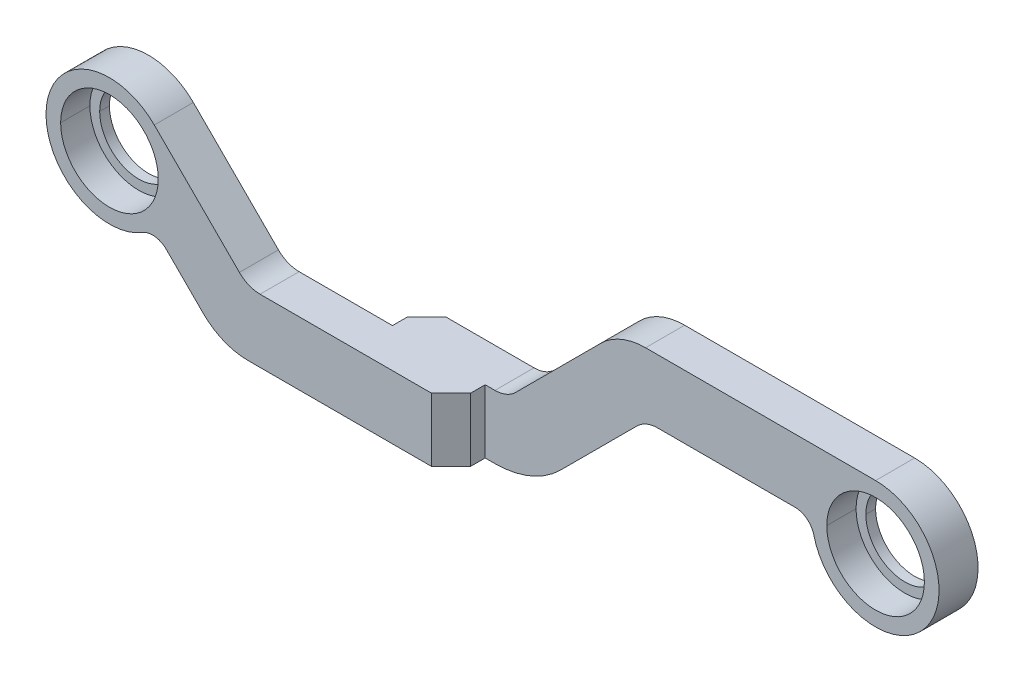
ISO-10303-21;
HEADER;
FILE_DESCRIPTION(('STEP AP214'),'2;1');
FILE_NAME('part.step','',(''),(''),'','','');
FILE_SCHEMA(('AUTOMOTIVE_DESIGN { 1 0 10303 214 1 1 1 1 }'));
ENDSEC;
DATA;
#1=APPLICATION_CONTEXT('core data for automotive mechanical design processes');
#2=APPLICATION_PROTOCOL_DEFINITION('international standard','automotive_design',2000,#1);
#3=PRODUCT_CONTEXT('',#1,'mechanical');
#4=PRODUCT('Part','Part','',(#3));
#5=PRODUCT_RELATED_PRODUCT_CATEGORY('part','',(#4));
#6=PRODUCT_DEFINITION_FORMATION('','',#4);
#7=PRODUCT_DEFINITION_CONTEXT('part definition',#1,'design');
#8=PRODUCT_DEFINITION('design','',#6,#7);
#9=PRODUCT_DEFINITION_SHAPE('','',#8);
#10=(LENGTH_UNIT() NAMED_UNIT(*) SI_UNIT(.MILLI.,.METRE.));
#11=(NAMED_UNIT(*) PLANE_ANGLE_UNIT() SI_UNIT($,.RADIAN.));
#12=(NAMED_UNIT(*) SI_UNIT($,.STERADIAN.) SOLID_ANGLE_UNIT());
#13=UNCERTAINTY_MEASURE_WITH_UNIT(LENGTH_MEASURE(1.E-05),#10,'distance_accuracy_value','');
#14=(GEOMETRIC_REPRESENTATION_CONTEXT(3) GLOBAL_UNCERTAINTY_ASSIGNED_CONTEXT((#13)) GLOBAL_UNIT_ASSIGNED_CONTEXT((#10,
#11,#12)) REPRESENTATION_CONTEXT('',''));
#15=CARTESIAN_POINT('',(0.,0.,0.));
#16=DIRECTION('',(0.,0.,1.));
#17=DIRECTION('',(1.,0.,0.));
#18=AXIS2_PLACEMENT_3D('',#15,#16,#17);
#19=CARTESIAN_POINT('',(66.7386441790709,-2.,4.));
#20=DIRECTION('',(0.,0.,-1.));
#21=DIRECTION('',(-1.,0.,0.));
#22=AXIS2_PLACEMENT_3D('',#19,#20,#21);
#23=CYLINDRICAL_SURFACE('',#22,2.);
#24=CARTESIAN_POINT('',(66.7386441790709,-2.,-3.5));
#25=DIRECTION('',(0.,0.,1.));
#26=DIRECTION('',(-1.,0.,0.));
#27=AXIS2_PLACEMENT_3D('',#24,#25,#26);
#28=CIRCLE('',#27,2.);
#29=CARTESIAN_POINT('',(68.6824926075248,-1.52941176470587,-3.5));
#30=VERTEX_POINT('',#29);
#31=CARTESIAN_POINT('',(66.7386441790709,0.,-3.5));
#32=VERTEX_POINT('',#31);
#33=EDGE_CURVE('E609',#30,#32,#28,.T.);
#34=ORIENTED_EDGE('',*,*,#33,.F.);
#35=DIRECTION('',(0.,0.,-1.));
#36=VECTOR('',#35,1.);
#37=CARTESIAN_POINT('',(68.6824926075248,-1.52941176470587,4.));
#38=LINE('',#37,#36);
#39=CARTESIAN_POINT('',(68.6824926075248,-1.52941176470587,0.5));
#40=VERTEX_POINT('',#39);
#41=EDGE_CURVE('E498',#40,#30,#38,.T.);
#42=ORIENTED_EDGE('',*,*,#41,.F.);
#43=CARTESIAN_POINT('',(66.7386441790709,-2.,0.5));
#44=DIRECTION('',(0.,0.,-1.));
#45=DIRECTION('',(-1.,0.,0.));
#46=AXIS2_PLACEMENT_3D('',#43,#44,#45);
#47=CIRCLE('',#46,2.);
#48=CARTESIAN_POINT('',(66.7386441790709,0.,0.5));
#49=VERTEX_POINT('',#48);
#50=EDGE_CURVE('E571',#49,#40,#47,.T.);
#51=ORIENTED_EDGE('',*,*,#50,.F.);
#52=DIRECTION('',(0.,0.,1.));
#53=VECTOR('',#52,1.);
#54=CARTESIAN_POINT('',(66.7386441790709,0.,-3.5));
#55=LINE('',#54,#53);
#56=EDGE_CURVE('E23',#32,#49,#55,.T.);
#57=ORIENTED_EDGE('',*,*,#56,.F.);
#58=EDGE_LOOP('',(#34,#42,#51,#57));
#59=FACE_BOUND('',#58,.T.);
#60=ADVANCED_FACE('F15',(#59),#23,.F.);
#61=CARTESIAN_POINT('',(52.6776695296637,-3.,-3.5));
#62=DIRECTION('',(0.,0.,-1.));
#63=DIRECTION('',(-1.,0.,0.));
#64=AXIS2_PLACEMENT_3D('',#61,#62,#63);
#65=CYLINDRICAL_SURFACE('',#64,3.);
#66=CARTESIAN_POINT('',(52.6776695296637,-3.,-3.5));
#67=DIRECTION('',(0.,0.,1.));
#68=DIRECTION('',(-1.,0.,0.));
#69=AXIS2_PLACEMENT_3D('',#66,#67,#68);
#70=CIRCLE('',#69,3.);
#71=CARTESIAN_POINT('',(52.6776695296637,0.,-3.5));
#72=VERTEX_POINT('',#71);
#73=CARTESIAN_POINT('',(50.5563491861041,-0.878679656440347,-3.5));
#74=VERTEX_POINT('',#73);
#75=EDGE_CURVE('E463',#72,#74,#70,.T.);
#76=ORIENTED_EDGE('',*,*,#75,.F.);
#77=DIRECTION('',(0.,0.,-1.));
#78=VECTOR('',#77,1.);
#79=CARTESIAN_POINT('',(52.6776695296637,0.,-3.5));
#80=LINE('',#79,#78);
#81=CARTESIAN_POINT('',(52.6776695296637,0.,0.5));
#82=VERTEX_POINT('',#81);
#83=EDGE_CURVE('E9',#82,#72,#80,.T.);
#84=ORIENTED_EDGE('',*,*,#83,.F.);
#85=CARTESIAN_POINT('',(52.6776695296637,-3.,0.5));
#86=DIRECTION('',(0.,0.,-1.));
#87=DIRECTION('',(-1.,0.,0.));
#88=AXIS2_PLACEMENT_3D('',#85,#86,#87);
#89=CIRCLE('',#88,3.);
#90=CARTESIAN_POINT('',(50.5563491861041,-0.878679656440347,0.5));
#91=VERTEX_POINT('',#90);
#92=EDGE_CURVE('E572',#91,#82,#89,.T.);
#93=ORIENTED_EDGE('',*,*,#92,.F.);
#94=DIRECTION('',(0.,0.,1.));
#95=VECTOR('',#94,1.);
#96=CARTESIAN_POINT('',(50.5563491861041,-0.878679656440347,0.5));
#97=LINE('',#96,#95);
#98=EDGE_CURVE('E510',#74,#91,#97,.T.);
#99=ORIENTED_EDGE('',*,*,#98,.F.);
#100=EDGE_LOOP('',(#76,#84,#93,#99));
#101=FACE_BOUND('',#100,.T.);
#102=ADVANCED_FACE('F663',(#101),#65,.F.);
#103=CARTESIAN_POINT('',(68.5,0.,-3.5));
#104=DIRECTION('',(0.,1.,0.));
#105=DIRECTION('',(1.,0.,0.));
#106=AXIS2_PLACEMENT_3D('',#103,#104,#105);
#107=PLANE('',#106);
#108=DIRECTION('',(-1.,0.,0.));
#109=VECTOR('',#108,1.);
#110=CARTESIAN_POINT('',(68.5,0.,-3.5));
#111=LINE('',#110,#109);
#112=EDGE_CURVE('E468',#32,#72,#111,.T.);
#113=ORIENTED_EDGE('',*,*,#112,.F.);
#114=ORIENTED_EDGE('',*,*,#56,.T.);
#115=DIRECTION('',(-1.,0.,0.));
#116=VECTOR('',#115,1.);
#117=CARTESIAN_POINT('',(68.5,0.,0.5));
#118=LINE('',#117,#116);
#119=EDGE_CURVE('E567',#49,#82,#118,.T.);
#120=ORIENTED_EDGE('',*,*,#119,.T.);
#121=ORIENTED_EDGE('',*,*,#83,.T.);
#122=EDGE_LOOP('',(#113,#114,#120,#121));
#123=FACE_BOUND('',#122,.T.);
#124=ADVANCED_FACE('F669',(#123),#107,.F.);
#125=CARTESIAN_POINT('',(42.7175144212722,-8.71751442127222,-3.5));
#126=DIRECTION('',(-0.707106781186547,0.707106781186548,0.));
#127=DIRECTION('',(0.,0.,1.));
#128=AXIS2_PLACEMENT_3D('',#125,#126,#127);
#129=PLANE('',#128);
#130=DIRECTION('',(-0.707106781186548,-0.707106781186547,0.));
#131=VECTOR('',#130,1.);
#132=CARTESIAN_POINT('',(42.7175144212722,-8.71751442127222,-3.5));
#133=LINE('',#132,#131);
#134=CARTESIAN_POINT('',(42.7175144212722,-8.71751442127222,-3.5));
#135=VERTEX_POINT('',#134);
#136=EDGE_CURVE('E467',#74,#135,#133,.T.);
#137=ORIENTED_EDGE('',*,*,#136,.F.);
#138=ORIENTED_EDGE('',*,*,#98,.T.);
#139=DIRECTION('',(-0.707106781186548,-0.707106781186547,0.));
#140=VECTOR('',#139,1.);
#141=CARTESIAN_POINT('',(42.7175144212722,-8.71751442127222,0.5));
#142=LINE('',#141,#140);
#143=CARTESIAN_POINT('',(42.7175144212722,-8.71751442127222,0.5));
#144=VERTEX_POINT('',#143);
#145=EDGE_CURVE('E619',#91,#144,#142,.T.);
#146=ORIENTED_EDGE('',*,*,#145,.T.);
#147=DIRECTION('',(0.,0.,1.));
#148=VECTOR('',#147,1.);
#149=CARTESIAN_POINT('',(42.7175144212722,-8.71751442127222,-3.5));
#150=LINE('',#149,#148);
#151=EDGE_CURVE('E437',#135,#144,#150,.T.);
#152=ORIENTED_EDGE('',*,*,#151,.F.);
#153=EDGE_LOOP('',(#137,#138,#146,#152));
#154=FACE_BOUND('',#153,.T.);
#155=ADVANCED_FACE('F645',(#154),#129,.F.);
#156=CARTESIAN_POINT('',(36.,-2.,-3.5));
#157=DIRECTION('',(0.,0.,1.));
#158=DIRECTION('',(1.,0.,0.));
#159=AXIS2_PLACEMENT_3D('',#156,#157,#158);
#160=CYLINDRICAL_SURFACE('',#159,9.5);
#161=CARTESIAN_POINT('',(36.,-2.,0.5));
#162=DIRECTION('',(0.,0.,-1.));
#163=DIRECTION('',(1.,0.,0.));
#164=AXIS2_PLACEMENT_3D('',#161,#162,#163);
#165=CIRCLE('',#164,9.5);
#166=CARTESIAN_POINT('',(36.,-11.5,0.5));
#167=VERTEX_POINT('',#166);
#168=EDGE_CURVE('E616',#144,#167,#165,.T.);
#169=ORIENTED_EDGE('',*,*,#168,.T.);
#170=DIRECTION('',(0.,0.,1.));
#171=VECTOR('',#170,1.);
#172=CARTESIAN_POINT('',(36.,-11.5,-3.5));
#173=LINE('',#172,#171);
#174=CARTESIAN_POINT('',(36.,-11.5,-3.5));
#175=VERTEX_POINT('',#174);
#176=EDGE_CURVE('E405',#175,#167,#173,.T.);
#177=ORIENTED_EDGE('',*,*,#176,.F.);
#178=CARTESIAN_POINT('',(36.,-2.,-3.5));
#179=DIRECTION('',(0.,0.,-1.));
#180=DIRECTION('',(1.,0.,0.));
#181=AXIS2_PLACEMENT_3D('',#178,#179,#180);
#182=CIRCLE('',#181,9.5);
#183=EDGE_CURVE('E597',#135,#175,#182,.T.);
#184=ORIENTED_EDGE('',*,*,#183,.F.);
#185=ORIENTED_EDGE('',*,*,#151,.T.);
#186=EDGE_LOOP('',(#169,#177,#184,#185));
#187=FACE_BOUND('',#186,.T.);
#188=ADVANCED_FACE('F639',(#187),#160,.T.);
#189=CARTESIAN_POINT('',(36.,-2.,-44.160177077824));
#190=DIRECTION('',(0.,0.,1.));
#191=DIRECTION('',(1.,0.,0.));
#192=AXIS2_PLACEMENT_3D('',#189,#190,#191);
#193=CYLINDRICAL_SURFACE('',#192,3.);
#194=DIRECTION('',(0.,0.,1.));
#195=VECTOR('',#194,1.);
#196=CARTESIAN_POINT('',(38.1213203435596,-4.12132034355967,-44.160177077824));
#197=LINE('',#196,#195);
#198=CARTESIAN_POINT('',(38.1213203435596,-4.12132034355967,-3.5));
#199=VERTEX_POINT('',#198);
#200=CARTESIAN_POINT('',(38.1213203435596,-4.12132034355967,0.5));
#201=VERTEX_POINT('',#200);
#202=EDGE_CURVE('E36',#199,#201,#197,.T.);
#203=ORIENTED_EDGE('',*,*,#202,.F.);
#204=CARTESIAN_POINT('',(36.,-2.,-3.5));
#205=DIRECTION('',(0.,0.,-1.));
#206=DIRECTION('',(-1.,0.,0.));
#207=AXIS2_PLACEMENT_3D('',#204,#205,#206);
#208=CIRCLE('',#207,3.);
#209=CARTESIAN_POINT('',(36.,-5.,-3.5));
#210=VERTEX_POINT('',#209);
#211=EDGE_CURVE('E559',#199,#210,#208,.T.);
#212=ORIENTED_EDGE('',*,*,#211,.T.);
#213=DIRECTION('',(0.,0.,1.));
#214=VECTOR('',#213,1.);
#215=CARTESIAN_POINT('',(36.,-5.,-44.160177077824));
#216=LINE('',#215,#214);
#217=CARTESIAN_POINT('',(36.,-5.,0.5));
#218=VERTEX_POINT('',#217);
#219=EDGE_CURVE('E476',#210,#218,#216,.T.);
#220=ORIENTED_EDGE('',*,*,#219,.T.);
#221=CARTESIAN_POINT('',(36.,-2.,0.5));
#222=DIRECTION('',(0.,0.,-1.));
#223=DIRECTION('',(-1.,0.,0.));
#224=AXIS2_PLACEMENT_3D('',#221,#222,#223);
#225=CIRCLE('',#224,3.);
#226=EDGE_CURVE('E377',#201,#218,#225,.T.);
#227=ORIENTED_EDGE('',*,*,#226,.F.);
#228=EDGE_LOOP('',(#203,#212,#220,#227));
#229=FACE_BOUND('',#228,.T.);
#230=ADVANCED_FACE('F812',(#229),#193,.F.);
#231=CARTESIAN_POINT('',(46.8388347648319,4.59619407771255,-44.160177077824));
#232=DIRECTION('',(-0.707106781186547,0.707106781186548,0.));
#233=DIRECTION('',(0.,0.,1.));
#234=AXIS2_PLACEMENT_3D('',#231,#232,#233);
#235=PLANE('',#234);
#236=DIRECTION('',(0.,0.,1.));
#237=VECTOR('',#236,1.);
#238=CARTESIAN_POINT('',(46.8388347648319,4.59619407771255,-44.160177077824));
#239=LINE('',#238,#237);
#240=CARTESIAN_POINT('',(46.8388347648319,4.59619407771255,-3.5));
#241=VERTEX_POINT('',#240);
#242=CARTESIAN_POINT('',(46.8388347648319,4.59619407771255,0.5));
#243=VERTEX_POINT('',#242);
#244=EDGE_CURVE('E47',#241,#243,#239,.T.);
#245=ORIENTED_EDGE('',*,*,#244,.F.);
#246=DIRECTION('',(-0.707106781186548,-0.707106781186547,0.));
#247=VECTOR('',#246,1.);
#248=CARTESIAN_POINT('',(46.8388347648319,4.59619407771255,-3.5));
#249=LINE('',#248,#247);
#250=EDGE_CURVE('E562',#241,#199,#249,.T.);
#251=ORIENTED_EDGE('',*,*,#250,.T.);
#252=ORIENTED_EDGE('',*,*,#202,.T.);
#253=DIRECTION('',(-0.707106781186548,-0.707106781186547,0.));
#254=VECTOR('',#253,1.);
#255=CARTESIAN_POINT('',(46.8388347648319,4.59619407771255,0.5));
#256=LINE('',#255,#254);
#257=EDGE_CURVE('E381',#243,#201,#256,.T.);
#258=ORIENTED_EDGE('',*,*,#257,.F.);
#259=EDGE_LOOP('',(#245,#251,#252,#258));
#260=FACE_BOUND('',#259,.T.);
#261=ADVANCED_FACE('F809',(#260),#235,.T.);
#262=CARTESIAN_POINT('',(51.4350288425444,0.,-44.160177077824));
#263=DIRECTION('',(0.,0.,1.));
#264=DIRECTION('',(1.,0.,0.));
#265=AXIS2_PLACEMENT_3D('',#262,#263,#264);
#266=CYLINDRICAL_SURFACE('',#265,6.5);
#267=DIRECTION('',(0.,0.,1.));
#268=VECTOR('',#267,1.);
#269=CARTESIAN_POINT('',(51.4350288425445,6.5,-44.160177077824));
#270=LINE('',#269,#268);
#271=CARTESIAN_POINT('',(51.4350288425445,6.5,-3.5));
#272=VERTEX_POINT('',#271);
#273=CARTESIAN_POINT('',(51.4350288425445,6.5,0.5));
#274=VERTEX_POINT('',#273);
#275=EDGE_CURVE('E376',#272,#274,#270,.T.);
#276=ORIENTED_EDGE('',*,*,#275,.F.);
#277=CARTESIAN_POINT('',(51.4350288425444,0.,-3.5));
#278=DIRECTION('',(0.,0.,1.));
#279=DIRECTION('',(-1.,0.,0.));
#280=AXIS2_PLACEMENT_3D('',#277,#278,#279);
#281=CIRCLE('',#280,6.5);
#282=EDGE_CURVE('E602',#272,#241,#281,.T.);
#283=ORIENTED_EDGE('',*,*,#282,.T.);
#284=ORIENTED_EDGE('',*,*,#244,.T.);
#285=CARTESIAN_POINT('',(51.4350288425444,0.,0.5));
#286=DIRECTION('',(0.,0.,1.));
#287=DIRECTION('',(1.,0.,0.));
#288=AXIS2_PLACEMENT_3D('',#285,#286,#287);
#289=CIRCLE('',#288,6.5);
#290=EDGE_CURVE('E480',#274,#243,#289,.T.);
#291=ORIENTED_EDGE('',*,*,#290,.F.);
#292=EDGE_LOOP('',(#276,#283,#284,#291));
#293=FACE_BOUND('',#292,.T.);
#294=ADVANCED_FACE('F679',(#293),#266,.T.);
#295=CARTESIAN_POINT('',(75.,6.5,-44.160177077824));
#296=DIRECTION('',(0.,1.,0.));
#297=DIRECTION('',(1.,0.,0.));
#298=AXIS2_PLACEMENT_3D('',#295,#296,#297);
#299=PLANE('',#298);
#300=DIRECTION('',(0.,0.,1.));
#301=VECTOR('',#300,1.);
#302=CARTESIAN_POINT('',(75.,6.5,-44.160177077824));
#303=LINE('',#302,#301);
#304=CARTESIAN_POINT('',(75.,6.5,-3.5));
#305=VERTEX_POINT('',#304);
#306=CARTESIAN_POINT('',(75.,6.5,0.5));
#307=VERTEX_POINT('',#306);
#308=EDGE_CURVE('E497',#305,#307,#303,.T.);
#309=ORIENTED_EDGE('',*,*,#308,.F.);
#310=DIRECTION('',(-1.,0.,0.));
#311=VECTOR('',#310,1.);
#312=CARTESIAN_POINT('',(75.,6.5,-3.5));
#313=LINE('',#312,#311);
#314=EDGE_CURVE('E605',#305,#272,#313,.T.);
#315=ORIENTED_EDGE('',*,*,#314,.T.);
#316=ORIENTED_EDGE('',*,*,#275,.T.);
#317=DIRECTION('',(-1.,0.,0.));
#318=VECTOR('',#317,1.);
#319=CARTESIAN_POINT('',(75.,6.5,0.5));
#320=LINE('',#319,#318);
#321=EDGE_CURVE('E628',#307,#274,#320,.T.);
#322=ORIENTED_EDGE('',*,*,#321,.F.);
#323=EDGE_LOOP('',(#309,#315,#316,#322));
#324=FACE_BOUND('',#323,.T.);
#325=ADVANCED_FACE('F677',(#324),#299,.T.);
#326=CARTESIAN_POINT('',(35.,6.501,2.));
#327=DIRECTION('',(0.707106781186548,0.,0.707106781186548));
#328=DIRECTION('',(0.,-1.,0.));
#329=AXIS2_PLACEMENT_3D('',#326,#327,#328);
#330=PLANE('',#329);
#331=DIRECTION('',(0.707106781186548,0.,-0.707106781186548));
#332=VECTOR('',#331,1.);
#333=CARTESIAN_POINT('',(16.5,-5.,20.5));
#334=LINE('',#333,#332);
#335=CARTESIAN_POINT('',(33.,-5.,4.));
#336=VERTEX_POINT('',#335);
#337=CARTESIAN_POINT('',(35.,-5.,2.));
#338=VERTEX_POINT('',#337);
#339=EDGE_CURVE('E415',#336,#338,#334,.T.);
#340=ORIENTED_EDGE('',*,*,#339,.F.);
#341=DIRECTION('',(0.,1.,0.));
#342=VECTOR('',#341,1.);
#343=CARTESIAN_POINT('',(33.,-5.,4.));
#344=LINE('',#343,#342);
#345=CARTESIAN_POINT('',(33.,-11.5,4.));
#346=VERTEX_POINT('',#345);
#347=EDGE_CURVE('E387',#346,#336,#344,.T.);
#348=ORIENTED_EDGE('',*,*,#347,.F.);
#349=DIRECTION('',(-0.707106781186548,0.,0.707106781186548));
#350=VECTOR('',#349,1.);
#351=CARTESIAN_POINT('',(35.,-11.5,2.));
#352=LINE('',#351,#350);
#353=CARTESIAN_POINT('',(35.,-11.5,2.));
#354=VERTEX_POINT('',#353);
#355=EDGE_CURVE('E429',#354,#346,#352,.T.);
#356=ORIENTED_EDGE('',*,*,#355,.F.);
#357=DIRECTION('',(0.,-1.,0.));
#358=VECTOR('',#357,1.);
#359=CARTESIAN_POINT('',(35.,-11.5,2.));
#360=LINE('',#359,#358);
#361=EDGE_CURVE('E547',#338,#354,#360,.T.);
#362=ORIENTED_EDGE('',*,*,#361,.F.);
#363=EDGE_LOOP('',(#340,#348,#356,#362));
#364=FACE_BOUND('',#363,.T.);
#365=ADVANCED_FACE('F800',(#364),#330,.T.);
#366=CARTESIAN_POINT('',(27.,-2.,-3.5));
#367=DIRECTION('',(-0.707106781186548,0.,-0.707106781186548));
#368=DIRECTION('',(-0.707106781186548,0.,0.707106781186548));
#369=AXIS2_PLACEMENT_3D('',#366,#367,#368);
#370=PLANE('',#369);
#371=DIRECTION('',(0.707106781186548,0.,-0.707106781186548));
#372=VECTOR('',#371,1.);
#373=CARTESIAN_POINT('',(27.,-11.5,-3.5));
#374=LINE('',#373,#372);
#375=CARTESIAN_POINT('',(25.,-11.5,-1.49999999999998));
#376=VERTEX_POINT('',#375);
#377=CARTESIAN_POINT('',(27.,-11.5,-3.5));
#378=VERTEX_POINT('',#377);
#379=EDGE_CURVE('E458',#376,#378,#374,.T.);
#380=ORIENTED_EDGE('',*,*,#379,.F.);
#381=DIRECTION('',(0.,-1.,0.));
#382=VECTOR('',#381,1.);
#383=CARTESIAN_POINT('',(25.,-11.5,-1.49999999999998));
#384=LINE('',#383,#382);
#385=CARTESIAN_POINT('',(25.,-5.,-1.49999999999998));
#386=VERTEX_POINT('',#385);
#387=EDGE_CURVE('E314',#386,#376,#384,.T.);
#388=ORIENTED_EDGE('',*,*,#387,.F.);
#389=DIRECTION('',(-0.707106781186548,0.,0.707106781186548));
#390=VECTOR('',#389,1.);
#391=CARTESIAN_POINT('',(9.75,-5.,13.75));
#392=LINE('',#391,#390);
#393=CARTESIAN_POINT('',(27.,-5.,-3.5));
#394=VERTEX_POINT('',#393);
#395=EDGE_CURVE('E502',#394,#386,#392,.T.);
#396=ORIENTED_EDGE('',*,*,#395,.F.);
#397=DIRECTION('',(0.,1.,0.));
#398=VECTOR('',#397,1.);
#399=CARTESIAN_POINT('',(27.,-5.,-3.5));
#400=LINE('',#399,#398);
#401=EDGE_CURVE('E563',#378,#394,#400,.T.);
#402=ORIENTED_EDGE('',*,*,#401,.F.);
#403=EDGE_LOOP('',(#380,#388,#396,#402));
#404=FACE_BOUND('',#403,.T.);
#405=ADVANCED_FACE('F796',(#404),#370,.T.);
#406=CARTESIAN_POINT('',(0.,0.,-3.5));
#407=DIRECTION('',(0.,0.,1.));
#408=DIRECTION('',(1.,0.,0.));
#409=AXIS2_PLACEMENT_3D('',#406,#407,#408);
#410=CYLINDRICAL_SURFACE('',#409,4.);
#411=DIRECTION('',(0.,0.,1.));
#412=VECTOR('',#411,1.);
#413=CARTESIAN_POINT('',(-4.,0.,-3.5));
#414=LINE('',#413,#412);
#415=CARTESIAN_POINT('',(-4.,0.,0.));
#416=VERTEX_POINT('',#415);
#417=CARTESIAN_POINT('',(-4.,0.,1.));
#418=VERTEX_POINT('',#417);
#419=EDGE_CURVE('E690',#416,#418,#414,.T.);
#420=ORIENTED_EDGE('',*,*,#419,.F.);
#421=CARTESIAN_POINT('',(0.,0.,0.));
#422=DIRECTION('',(0.,0.,1.));
#423=DIRECTION('',(1.,0.,0.));
#424=AXIS2_PLACEMENT_3D('',#421,#422,#423);
#425=CIRCLE('',#424,4.);
#426=CARTESIAN_POINT('',(4.,0.,0.));
#427=VERTEX_POINT('',#426);
#428=EDGE_CURVE('E354',#427,#416,#425,.T.);
#429=ORIENTED_EDGE('',*,*,#428,.F.);
#430=DIRECTION('',(0.,0.,1.));
#431=VECTOR('',#430,1.);
#432=CARTESIAN_POINT('',(4.,0.,-3.5));
#433=LINE('',#432,#431);
#434=CARTESIAN_POINT('',(4.,0.,1.));
#435=VERTEX_POINT('',#434);
#436=EDGE_CURVE('E340',#427,#435,#433,.T.);
#437=ORIENTED_EDGE('',*,*,#436,.T.);
#438=CARTESIAN_POINT('',(0.,0.,1.));
#439=DIRECTION('',(0.,0.,1.));
#440=DIRECTION('',(1.,0.,0.));
#441=AXIS2_PLACEMENT_3D('',#438,#439,#440);
#442=CIRCLE('',#441,4.);
#443=EDGE_CURVE('E395',#435,#418,#442,.T.);
#444=ORIENTED_EDGE('',*,*,#443,.T.);
#445=EDGE_LOOP('',(#420,#429,#437,#444));
#446=FACE_BOUND('',#445,.T.);
#447=ADVANCED_FACE('F799',(#446),#410,.F.);
#448=CARTESIAN_POINT('',(0.,0.,1.));
#449=DIRECTION('',(0.,0.,1.));
#450=DIRECTION('',(1.,0.,0.));
#451=AXIS2_PLACEMENT_3D('',#448,#449,#450);
#452=PLANE('',#451);
#453=ORIENTED_EDGE('',*,*,#443,.F.);
#454=CARTESIAN_POINT('',(0.,0.,1.));
#455=DIRECTION('',(0.,0.,1.));
#456=DIRECTION('',(1.,0.,0.));
#457=AXIS2_PLACEMENT_3D('',#454,#455,#456);
#458=CIRCLE('',#457,4.);
#459=EDGE_CURVE('E338',#418,#435,#458,.T.);
#460=ORIENTED_EDGE('',*,*,#459,.F.);
#461=EDGE_LOOP('',(#453,#460));
#462=FACE_BOUND('',#461,.T.);
#463=CARTESIAN_POINT('',(0.,0.,1.));
#464=DIRECTION('',(0.,0.,1.));
#465=DIRECTION('',(1.,0.,0.));
#466=AXIS2_PLACEMENT_3D('',#463,#464,#465);
#467=CIRCLE('',#466,5.);
#468=CARTESIAN_POINT('',(5.,0.,1.));
#469=VERTEX_POINT('',#468);
#470=CARTESIAN_POINT('',(-5.,0.,1.));
#471=VERTEX_POINT('',#470);
#472=EDGE_CURVE('E320',#469,#471,#467,.T.);
#473=ORIENTED_EDGE('',*,*,#472,.T.);
#474=CARTESIAN_POINT('',(0.,0.,1.));
#475=DIRECTION('',(0.,0.,1.));
#476=DIRECTION('',(1.,0.,0.));
#477=AXIS2_PLACEMENT_3D('',#474,#475,#476);
#478=CIRCLE('',#477,5.);
#479=EDGE_CURVE('E334',#471,#469,#478,.T.);
#480=ORIENTED_EDGE('',*,*,#479,.T.);
#481=EDGE_LOOP('',(#473,#480));
#482=FACE_BOUND('',#481,.T.);
#483=ADVANCED_FACE('F795',(#462,#482),#452,.T.);
#484=CARTESIAN_POINT('',(0.,0.,1.));
#485=DIRECTION('',(0.,0.,1.));
#486=DIRECTION('',(1.,0.,0.));
#487=AXIS2_PLACEMENT_3D('',#484,#485,#486);
#488=CYLINDRICAL_SURFACE('',#487,5.);
#489=DIRECTION('',(0.,0.,1.));
#490=VECTOR('',#489,1.);
#491=CARTESIAN_POINT('',(-5.,0.,1.));
#492=LINE('',#491,#490);
#493=CARTESIAN_POINT('',(-5.,0.,4.));
#494=VERTEX_POINT('',#493);
#495=EDGE_CURVE('E328',#471,#494,#492,.T.);
#496=ORIENTED_EDGE('',*,*,#495,.F.);
#497=ORIENTED_EDGE('',*,*,#472,.F.);
#498=DIRECTION('',(0.,0.,1.));
#499=VECTOR('',#498,1.);
#500=CARTESIAN_POINT('',(5.,0.,1.));
#501=LINE('',#500,#499);
#502=CARTESIAN_POINT('',(5.,0.,4.));
#503=VERTEX_POINT('',#502);
#504=EDGE_CURVE('E318',#469,#503,#501,.T.);
#505=ORIENTED_EDGE('',*,*,#504,.T.);
#506=CARTESIAN_POINT('',(0.,0.,4.));
#507=DIRECTION('',(0.,0.,1.));
#508=DIRECTION('',(1.,0.,0.));
#509=AXIS2_PLACEMENT_3D('',#506,#507,#508);
#510=CIRCLE('',#509,5.);
#511=EDGE_CURVE('E304',#503,#494,#510,.T.);
#512=ORIENTED_EDGE('',*,*,#511,.T.);
#513=EDGE_LOOP('',(#496,#497,#505,#512));
#514=FACE_BOUND('',#513,.T.);
#515=ADVANCED_FACE('F319',(#514),#488,.F.);
#516=CARTESIAN_POINT('',(75.,0.,-3.5));
#517=DIRECTION('',(0.,0.,1.));
#518=DIRECTION('',(1.,0.,0.));
#519=AXIS2_PLACEMENT_3D('',#516,#517,#518);
#520=CYLINDRICAL_SURFACE('',#519,4.);
#521=DIRECTION('',(0.,0.,1.));
#522=VECTOR('',#521,1.);
#523=CARTESIAN_POINT('',(71.,0.,-3.5));
#524=LINE('',#523,#522);
#525=CARTESIAN_POINT('',(71.,0.,-3.5));
#526=VERTEX_POINT('',#525);
#527=CARTESIAN_POINT('',(71.,0.,-2.5));
#528=VERTEX_POINT('',#527);
#529=EDGE_CURVE('E366',#526,#528,#524,.T.);
#530=ORIENTED_EDGE('',*,*,#529,.F.);
#531=CARTESIAN_POINT('',(75.,0.,-3.5));
#532=DIRECTION('',(0.,0.,1.));
#533=DIRECTION('',(1.,0.,0.));
#534=AXIS2_PLACEMENT_3D('',#531,#532,#533);
#535=CIRCLE('',#534,4.);
#536=CARTESIAN_POINT('',(79.,0.,-3.5));
#537=VERTEX_POINT('',#536);
#538=EDGE_CURVE('E484',#537,#526,#535,.T.);
#539=ORIENTED_EDGE('',*,*,#538,.F.);
#540=DIRECTION('',(0.,0.,1.));
#541=VECTOR('',#540,1.);
#542=CARTESIAN_POINT('',(79.,0.,-3.5));
#543=LINE('',#542,#541);
#544=CARTESIAN_POINT('',(79.,0.,-2.5));
#545=VERTEX_POINT('',#544);
#546=EDGE_CURVE('E362',#537,#545,#543,.T.);
#547=ORIENTED_EDGE('',*,*,#546,.T.);
#548=CARTESIAN_POINT('',(75.,0.,-2.5));
#549=DIRECTION('',(0.,0.,1.));
#550=DIRECTION('',(1.,0.,0.));
#551=AXIS2_PLACEMENT_3D('',#548,#549,#550);
#552=CIRCLE('',#551,4.);
#553=EDGE_CURVE('E546',#545,#528,#552,.T.);
#554=ORIENTED_EDGE('',*,*,#553,.T.);
#555=EDGE_LOOP('',(#530,#539,#547,#554));
#556=FACE_BOUND('',#555,.T.);
#557=ADVANCED_FACE('F789',(#556),#520,.F.);
#558=CARTESIAN_POINT('',(75.,0.,-2.5));
#559=DIRECTION('',(0.,0.,1.));
#560=DIRECTION('',(1.,0.,0.));
#561=AXIS2_PLACEMENT_3D('',#558,#559,#560);
#562=PLANE('',#561);
#563=ORIENTED_EDGE('',*,*,#553,.F.);
#564=CARTESIAN_POINT('',(75.,0.,-2.5));
#565=DIRECTION('',(0.,0.,1.));
#566=DIRECTION('',(1.,0.,0.));
#567=AXIS2_PLACEMENT_3D('',#564,#565,#566);
#568=CIRCLE('',#567,4.);
#569=EDGE_CURVE('E370',#528,#545,#568,.T.);
#570=ORIENTED_EDGE('',*,*,#569,.F.);
#571=EDGE_LOOP('',(#563,#570));
#572=FACE_BOUND('',#571,.T.);
#573=CARTESIAN_POINT('',(75.,0.,-2.5));
#574=DIRECTION('',(0.,0.,1.));
#575=DIRECTION('',(1.,0.,0.));
#576=AXIS2_PLACEMENT_3D('',#573,#574,#575);
#577=CIRCLE('',#576,5.);
#578=CARTESIAN_POINT('',(80.,0.,-2.5));
#579=VERTEX_POINT('',#578);
#580=CARTESIAN_POINT('',(70.,0.,-2.5));
#581=VERTEX_POINT('',#580);
#582=EDGE_CURVE('E543',#579,#581,#577,.T.);
#583=ORIENTED_EDGE('',*,*,#582,.T.);
#584=CARTESIAN_POINT('',(75.,0.,-2.5));
#585=DIRECTION('',(0.,0.,1.));
#586=DIRECTION('',(1.,0.,0.));
#587=AXIS2_PLACEMENT_3D('',#584,#585,#586);
#588=CIRCLE('',#587,5.);
#589=EDGE_CURVE('E357',#581,#579,#588,.T.);
#590=ORIENTED_EDGE('',*,*,#589,.T.);
#591=EDGE_LOOP('',(#583,#590));
#592=FACE_BOUND('',#591,.T.);
#593=ADVANCED_FACE('F787',(#572,#592),#562,.T.);
#594=CARTESIAN_POINT('',(75.,0.,-2.5));
#595=DIRECTION('',(0.,0.,1.));
#596=DIRECTION('',(1.,0.,0.));
#597=AXIS2_PLACEMENT_3D('',#594,#595,#596);
#598=CYLINDRICAL_SURFACE('',#597,5.);
#599=DIRECTION('',(0.,0.,1.));
#600=VECTOR('',#599,1.);
#601=CARTESIAN_POINT('',(70.,0.,-2.5));
#602=LINE('',#601,#600);
#603=CARTESIAN_POINT('',(70.,0.,0.5));
#604=VERTEX_POINT('',#603);
#605=EDGE_CURVE('E361',#581,#604,#602,.T.);
#606=ORIENTED_EDGE('',*,*,#605,.F.);
#607=ORIENTED_EDGE('',*,*,#582,.F.);
#608=DIRECTION('',(0.,0.,1.));
#609=VECTOR('',#608,1.);
#610=CARTESIAN_POINT('',(80.,0.,-2.5));
#611=LINE('',#610,#609);
#612=CARTESIAN_POINT('',(80.,0.,0.5));
#613=VERTEX_POINT('',#612);
#614=EDGE_CURVE('E344',#579,#613,#611,.T.);
#615=ORIENTED_EDGE('',*,*,#614,.T.);
#616=CARTESIAN_POINT('',(75.,0.,0.5));
#617=DIRECTION('',(0.,0.,1.));
#618=DIRECTION('',(1.,0.,0.));
#619=AXIS2_PLACEMENT_3D('',#616,#617,#618);
#620=CIRCLE('',#619,5.);
#621=EDGE_CURVE('E454',#613,#604,#620,.T.);
#622=ORIENTED_EDGE('',*,*,#621,.T.);
#623=EDGE_LOOP('',(#606,#607,#615,#622));
#624=FACE_BOUND('',#623,.T.);
#625=ADVANCED_FACE('F783',(#624),#598,.F.);
#626=CARTESIAN_POINT('',(35.,6.501,4.));
#627=DIRECTION('',(-1.,0.,0.));
#628=DIRECTION('',(0.,0.,1.));
#629=AXIS2_PLACEMENT_3D('',#626,#627,#628);
#630=PLANE('',#629);
#631=DIRECTION('',(0.,0.,-1.));
#632=VECTOR('',#631,1.);
#633=CARTESIAN_POINT('',(35.,-5.,4.));
#634=LINE('',#633,#632);
#635=CARTESIAN_POINT('',(35.,-5.,0.5));
#636=VERTEX_POINT('',#635);
#637=EDGE_CURVE('E419',#338,#636,#634,.T.);
#638=ORIENTED_EDGE('',*,*,#637,.F.);
#639=ORIENTED_EDGE('',*,*,#361,.T.);
#640=DIRECTION('',(0.,0.,-1.));
#641=VECTOR('',#640,1.);
#642=CARTESIAN_POINT('',(35.,-11.5,4.));
#643=LINE('',#642,#641);
#644=CARTESIAN_POINT('',(35.,-11.5,0.5));
#645=VERTEX_POINT('',#644);
#646=EDGE_CURVE('E414',#354,#645,#643,.T.);
#647=ORIENTED_EDGE('',*,*,#646,.T.);
#648=DIRECTION('',(0.,-1.,0.));
#649=VECTOR('',#648,1.);
#650=CARTESIAN_POINT('',(35.,6.501,0.5));
#651=LINE('',#650,#649);
#652=EDGE_CURVE('E380',#636,#645,#651,.T.);
#653=ORIENTED_EDGE('',*,*,#652,.F.);
#654=EDGE_LOOP('',(#638,#639,#647,#653));
#655=FACE_BOUND('',#654,.T.);
#656=ADVANCED_FACE('F779',(#655),#630,.F.);
#657=CARTESIAN_POINT('',(35.,6.501,0.5));
#658=DIRECTION('',(0.,0.,-1.));
#659=DIRECTION('',(0.,-1.,0.));
#660=AXIS2_PLACEMENT_3D('',#657,#658,#659);
#661=PLANE('',#660);
#662=ORIENTED_EDGE('',*,*,#621,.F.);
#663=CARTESIAN_POINT('',(75.,0.,0.5));
#664=DIRECTION('',(0.,0.,1.));
#665=DIRECTION('',(1.,0.,0.));
#666=AXIS2_PLACEMENT_3D('',#663,#664,#665);
#667=CIRCLE('',#666,5.);
#668=EDGE_CURVE('E349',#604,#613,#667,.T.);
#669=ORIENTED_EDGE('',*,*,#668,.F.);
#670=EDGE_LOOP('',(#662,#669));
#671=FACE_BOUND('',#670,.T.);
#672=DIRECTION('',(1.,0.,0.));
#673=VECTOR('',#672,1.);
#674=CARTESIAN_POINT('',(35.,-11.5,0.5));
#675=LINE('',#674,#673);
#676=EDGE_CURVE('E410',#645,#167,#675,.T.);
#677=ORIENTED_EDGE('',*,*,#676,.T.);
#678=ORIENTED_EDGE('',*,*,#168,.F.);
#679=ORIENTED_EDGE('',*,*,#145,.F.);
#680=ORIENTED_EDGE('',*,*,#92,.T.);
#681=ORIENTED_EDGE('',*,*,#119,.F.);
#682=ORIENTED_EDGE('',*,*,#50,.T.);
#683=CARTESIAN_POINT('',(75.,0.,0.5));
#684=DIRECTION('',(0.,0.,-1.));
#685=DIRECTION('',(-1.,0.,0.));
#686=AXIS2_PLACEMENT_3D('',#683,#684,#685);
#687=CIRCLE('',#686,6.5);
#688=EDGE_CURVE('E527',#307,#40,#687,.T.);
#689=ORIENTED_EDGE('',*,*,#688,.F.);
#690=ORIENTED_EDGE('',*,*,#321,.T.);
#691=ORIENTED_EDGE('',*,*,#290,.T.);
#692=ORIENTED_EDGE('',*,*,#257,.T.);
#693=ORIENTED_EDGE('',*,*,#226,.T.);
#694=DIRECTION('',(1.,0.,0.));
#695=VECTOR('',#694,1.);
#696=CARTESIAN_POINT('',(35.,-5.,0.5));
#697=LINE('',#696,#695);
#698=EDGE_CURVE('E472',#636,#218,#697,.T.);
#699=ORIENTED_EDGE('',*,*,#698,.F.);
#700=ORIENTED_EDGE('',*,*,#652,.T.);
#701=EDGE_LOOP('',(#677,#678,#679,#680,#681,#682,#689,#690,#691,#692,#693,#699,#700));
#702=FACE_BOUND('',#701,.T.);
#703=ADVANCED_FACE('F648',(#671,#702),#661,.F.);
#704=CARTESIAN_POINT('',(4.42744716040083,-7.25587428514708,4.));
#705=DIRECTION('',(0.,0.,-1.));
#706=DIRECTION('',(-1.,0.,0.));
#707=AXIS2_PLACEMENT_3D('',#704,#705,#706);
#708=CYLINDRICAL_SURFACE('',#707,2.);
#709=CARTESIAN_POINT('',(4.42744716040083,-7.25587428514708,4.));
#710=DIRECTION('',(0.,0.,-1.));
#711=DIRECTION('',(1.,0.,0.));
#712=AXIS2_PLACEMENT_3D('',#709,#710,#711);
#713=CIRCLE('',#712,2.);
#714=CARTESIAN_POINT('',(3.38569488736534,-5.54860974746541,4.));
#715=VERTEX_POINT('',#714);
#716=CARTESIAN_POINT('',(5.84166072277394,-5.84166072277399,4.));
#717=VERTEX_POINT('',#716);
#718=EDGE_CURVE('E315',#715,#717,#713,.T.);
#719=ORIENTED_EDGE('',*,*,#718,.F.);
#720=DIRECTION('',(0.,0.,1.));
#721=VECTOR('',#720,1.);
#722=CARTESIAN_POINT('',(3.38569488736534,-5.54860974746541,4.));
#723=LINE('',#722,#721);
#724=CARTESIAN_POINT('',(3.38569488736534,-5.54860974746541,0.));
#725=VERTEX_POINT('',#724);
#726=EDGE_CURVE('E402',#725,#715,#723,.T.);
#727=ORIENTED_EDGE('',*,*,#726,.F.);
#728=CARTESIAN_POINT('',(4.42744716040083,-7.25587428514708,0.));
#729=DIRECTION('',(0.,0.,1.));
#730=DIRECTION('',(1.,0.,0.));
#731=AXIS2_PLACEMENT_3D('',#728,#729,#730);
#732=CIRCLE('',#731,2.);
#733=CARTESIAN_POINT('',(5.84166072277394,-5.84166072277399,0.));
#734=VERTEX_POINT('',#733);
#735=EDGE_CURVE('E446',#734,#725,#732,.T.);
#736=ORIENTED_EDGE('',*,*,#735,.F.);
#737=DIRECTION('',(0.,0.,-1.));
#738=VECTOR('',#737,1.);
#739=CARTESIAN_POINT('',(5.84166072277393,-5.84166072277399,0.));
#740=LINE('',#739,#738);
#741=EDGE_CURVE('E536',#717,#734,#740,.T.);
#742=ORIENTED_EDGE('',*,*,#741,.F.);
#743=EDGE_LOOP('',(#719,#727,#736,#742));
#744=FACE_BOUND('',#743,.T.);
#745=ADVANCED_FACE('F720',(#744),#708,.F.);
#746=CARTESIAN_POINT('',(59.5649711574556,-2.,-3.5));
#747=DIRECTION('',(0.,0.,-1.));
#748=DIRECTION('',(0.,-1.,0.));
#749=AXIS2_PLACEMENT_3D('',#746,#747,#748);
#750=PLANE('',#749);
#751=ORIENTED_EDGE('',*,*,#538,.T.);
#752=CARTESIAN_POINT('',(75.,0.,-3.5));
#753=DIRECTION('',(0.,0.,1.));
#754=DIRECTION('',(1.,0.,0.));
#755=AXIS2_PLACEMENT_3D('',#752,#753,#754);
#756=CIRCLE('',#755,4.);
#757=EDGE_CURVE('E325',#526,#537,#756,.T.);
#758=ORIENTED_EDGE('',*,*,#757,.T.);
#759=EDGE_LOOP('',(#751,#758));
#760=FACE_BOUND('',#759,.T.);
#761=ORIENTED_EDGE('',*,*,#183,.T.);
#762=DIRECTION('',(-1.,0.,0.));
#763=VECTOR('',#762,1.);
#764=CARTESIAN_POINT('',(60.8076118445749,-11.5,-3.5));
#765=LINE('',#764,#763);
#766=EDGE_CURVE('E462',#175,#378,#765,.T.);
#767=ORIENTED_EDGE('',*,*,#766,.T.);
#768=ORIENTED_EDGE('',*,*,#401,.T.);
#769=DIRECTION('',(1.,0.,0.));
#770=VECTOR('',#769,1.);
#771=CARTESIAN_POINT('',(25.,-5.,-3.5));
#772=LINE('',#771,#770);
#773=EDGE_CURVE('E488',#394,#210,#772,.T.);
#774=ORIENTED_EDGE('',*,*,#773,.T.);
#775=ORIENTED_EDGE('',*,*,#211,.F.);
#776=ORIENTED_EDGE('',*,*,#250,.F.);
#777=ORIENTED_EDGE('',*,*,#282,.F.);
#778=ORIENTED_EDGE('',*,*,#314,.F.);
#779=CARTESIAN_POINT('',(75.,0.,-3.5));
#780=DIRECTION('',(0.,0.,-1.));
#781=DIRECTION('',(-1.,0.,0.));
#782=AXIS2_PLACEMENT_3D('',#779,#780,#781);
#783=CIRCLE('',#782,6.5);
#784=EDGE_CURVE('E493',#305,#30,#783,.T.);
#785=ORIENTED_EDGE('',*,*,#784,.T.);
#786=ORIENTED_EDGE('',*,*,#33,.T.);
#787=ORIENTED_EDGE('',*,*,#112,.T.);
#788=ORIENTED_EDGE('',*,*,#75,.T.);
#789=ORIENTED_EDGE('',*,*,#136,.T.);
#790=EDGE_LOOP('',(#761,#767,#768,#774,#775,#776,#777,#778,#785,#786,#787,#788,#789));
#791=FACE_BOUND('',#790,.T.);
#792=ADVANCED_FACE('F658',(#760,#791),#750,.T.);
#793=CARTESIAN_POINT('',(25.,-5.,-3.5));
#794=DIRECTION('',(1.,0.,0.));
#795=DIRECTION('',(0.,1.,0.));
#796=AXIS2_PLACEMENT_3D('',#793,#794,#795);
#797=PLANE('',#796);
#798=DIRECTION('',(0.,0.,1.));
#799=VECTOR('',#798,1.);
#800=CARTESIAN_POINT('',(25.,-5.,-3.5));
#801=LINE('',#800,#799);
#802=CARTESIAN_POINT('',(25.,-5.,0.));
#803=VERTEX_POINT('',#802);
#804=EDGE_CURVE('E506',#386,#803,#801,.T.);
#805=ORIENTED_EDGE('',*,*,#804,.F.);
#806=ORIENTED_EDGE('',*,*,#387,.T.);
#807=DIRECTION('',(0.,0.,1.));
#808=VECTOR('',#807,1.);
#809=CARTESIAN_POINT('',(25.,-11.5,-3.5));
#810=LINE('',#809,#808);
#811=CARTESIAN_POINT('',(25.,-11.5,0.));
#812=VERTEX_POINT('',#811);
#813=EDGE_CURVE('E451',#376,#812,#810,.T.);
#814=ORIENTED_EDGE('',*,*,#813,.T.);
#815=DIRECTION('',(0.,1.,0.));
#816=VECTOR('',#815,1.);
#817=CARTESIAN_POINT('',(25.,-5.,0.));
#818=LINE('',#817,#816);
#819=EDGE_CURVE('E540',#812,#803,#818,.T.);
#820=ORIENTED_EDGE('',*,*,#819,.T.);
#821=EDGE_LOOP('',(#805,#806,#814,#820));
#822=FACE_BOUND('',#821,.T.);
#823=ADVANCED_FACE('F742',(#822),#797,.F.);
#824=CARTESIAN_POINT('',(0.,0.,4.));
#825=DIRECTION('',(0.,0.,1.));
#826=DIRECTION('',(1.,0.,0.));
#827=AXIS2_PLACEMENT_3D('',#824,#825,#826);
#828=PLANE('',#827);
#829=ORIENTED_EDGE('',*,*,#511,.F.);
#830=CARTESIAN_POINT('',(0.,0.,4.));
#831=DIRECTION('',(0.,0.,1.));
#832=DIRECTION('',(1.,0.,0.));
#833=AXIS2_PLACEMENT_3D('',#830,#831,#832);
#834=CIRCLE('',#833,5.);
#835=EDGE_CURVE('E309',#494,#503,#834,.T.);
#836=ORIENTED_EDGE('',*,*,#835,.F.);
#837=EDGE_LOOP('',(#829,#836));
#838=FACE_BOUND('',#837,.T.);
#839=DIRECTION('',(1.,0.,0.));
#840=VECTOR('',#839,1.);
#841=CARTESIAN_POINT('',(0.,-11.5,4.));
#842=LINE('',#841,#840);
#843=CARTESIAN_POINT('',(14.1923881554251,-11.5,4.));
#844=VERTEX_POINT('',#843);
#845=EDGE_CURVE('E430',#844,#346,#842,.T.);
#846=ORIENTED_EDGE('',*,*,#845,.T.);
#847=ORIENTED_EDGE('',*,*,#347,.T.);
#848=DIRECTION('',(1.,0.,0.));
#849=VECTOR('',#848,1.);
#850=CARTESIAN_POINT('',(0.,-5.,4.));
#851=LINE('',#850,#849);
#852=CARTESIAN_POINT('',(15.4350288425445,-5.,4.));
#853=VERTEX_POINT('',#852);
#854=EDGE_CURVE('E420',#853,#336,#851,.T.);
#855=ORIENTED_EDGE('',*,*,#854,.F.);
#856=CARTESIAN_POINT('',(15.4350288425445,-2.,4.));
#857=DIRECTION('',(0.,0.,1.));
#858=DIRECTION('',(1.,0.,0.));
#859=AXIS2_PLACEMENT_3D('',#856,#857,#858);
#860=CIRCLE('',#859,3.);
#861=CARTESIAN_POINT('',(13.3137084989848,-4.12132034355967,4.));
#862=VERTEX_POINT('',#861);
#863=EDGE_CURVE('E517',#862,#853,#860,.T.);
#864=ORIENTED_EDGE('',*,*,#863,.F.);
#865=DIRECTION('',(0.707106781186549,-0.707106781186546,0.));
#866=VECTOR('',#865,1.);
#867=CARTESIAN_POINT('',(4.59619407771255,4.59619407771257,4.));
#868=LINE('',#867,#866);
#869=CARTESIAN_POINT('',(4.59619407771255,4.59619407771257,4.));
#870=VERTEX_POINT('',#869);
#871=EDGE_CURVE('E516',#870,#862,#868,.T.);
#872=ORIENTED_EDGE('',*,*,#871,.F.);
#873=CARTESIAN_POINT('',(0.,0.,4.));
#874=DIRECTION('',(0.,0.,1.));
#875=DIRECTION('',(1.,0.,0.));
#876=AXIS2_PLACEMENT_3D('',#873,#874,#875);
#877=CIRCLE('',#876,6.5);
#878=CARTESIAN_POINT('',(-6.5,0.,4.));
#879=VERTEX_POINT('',#878);
#880=EDGE_CURVE('E580',#870,#879,#877,.T.);
#881=ORIENTED_EDGE('',*,*,#880,.T.);
#882=CARTESIAN_POINT('',(0.,0.,4.));
#883=DIRECTION('',(0.,0.,1.));
#884=DIRECTION('',(1.,0.,0.));
#885=AXIS2_PLACEMENT_3D('',#882,#883,#884);
#886=CIRCLE('',#885,6.5);
#887=EDGE_CURVE('E348',#879,#715,#886,.T.);
#888=ORIENTED_EDGE('',*,*,#887,.T.);
#889=ORIENTED_EDGE('',*,*,#718,.T.);
#890=DIRECTION('',(0.707106781186544,-0.707106781186551,0.));
#891=VECTOR('',#890,1.);
#892=CARTESIAN_POINT('',(0.,0.,4.));
#893=LINE('',#892,#891);
#894=CARTESIAN_POINT('',(9.59619407771249,-9.59619407771257,4.));
#895=VERTEX_POINT('',#894);
#896=EDGE_CURVE('E583',#717,#895,#893,.T.);
#897=ORIENTED_EDGE('',*,*,#896,.T.);
#898=CARTESIAN_POINT('',(14.1923881554251,-5.,4.));
#899=DIRECTION('',(0.,0.,1.));
#900=DIRECTION('',(1.,0.,0.));
#901=AXIS2_PLACEMENT_3D('',#898,#899,#900);
#902=CIRCLE('',#901,6.5);
#903=EDGE_CURVE('E489',#895,#844,#902,.T.);
#904=ORIENTED_EDGE('',*,*,#903,.T.);
#905=EDGE_LOOP('',(#846,#847,#855,#864,#872,#881,#888,#889,#897,#904));
#906=FACE_BOUND('',#905,.T.);
#907=ADVANCED_FACE('F306',(#838,#906),#828,.T.);
#908=CARTESIAN_POINT('',(14.1923881554251,-5.,4.));
#909=DIRECTION('',(0.,0.,-1.));
#910=DIRECTION('',(-1.,0.,0.));
#911=AXIS2_PLACEMENT_3D('',#908,#909,#910);
#912=CYLINDRICAL_SURFACE('',#911,6.5);
#913=CARTESIAN_POINT('',(14.1923881554251,-5.,0.));
#914=DIRECTION('',(0.,0.,1.));
#915=DIRECTION('',(1.,0.,0.));
#916=AXIS2_PLACEMENT_3D('',#913,#914,#915);
#917=CIRCLE('',#916,6.5);
#918=CARTESIAN_POINT('',(9.59619407771249,-9.59619407771257,0.));
#919=VERTEX_POINT('',#918);
#920=CARTESIAN_POINT('',(14.1923881554251,-11.5,0.));
#921=VERTEX_POINT('',#920);
#922=EDGE_CURVE('E447',#919,#921,#917,.T.);
#923=ORIENTED_EDGE('',*,*,#922,.T.);
#924=DIRECTION('',(0.,0.,-1.));
#925=VECTOR('',#924,1.);
#926=CARTESIAN_POINT('',(14.1923881554251,-11.5,4.));
#927=LINE('',#926,#925);
#928=EDGE_CURVE('E434',#844,#921,#927,.T.);
#929=ORIENTED_EDGE('',*,*,#928,.F.);
#930=ORIENTED_EDGE('',*,*,#903,.F.);
#931=DIRECTION('',(0.,0.,-1.));
#932=VECTOR('',#931,1.);
#933=CARTESIAN_POINT('',(9.59619407771249,-9.59619407771257,4.));
#934=LINE('',#933,#932);
#935=EDGE_CURVE('E492',#895,#919,#934,.T.);
#936=ORIENTED_EDGE('',*,*,#935,.T.);
#937=EDGE_LOOP('',(#923,#929,#930,#936));
#938=FACE_BOUND('',#937,.T.);
#939=ADVANCED_FACE('F747',(#938),#912,.T.);
#940=CARTESIAN_POINT('',(0.,0.,4.));
#941=DIRECTION('',(0.707106781186551,0.707106781186544,0.));
#942=DIRECTION('',(0.,0.,-1.));
#943=AXIS2_PLACEMENT_3D('',#940,#941,#942);
#944=PLANE('',#943);
#945=ORIENTED_EDGE('',*,*,#896,.F.);
#946=ORIENTED_EDGE('',*,*,#741,.T.);
#947=DIRECTION('',(0.707106781186544,-0.707106781186551,0.));
#948=VECTOR('',#947,1.);
#949=CARTESIAN_POINT('',(0.,0.,0.));
#950=LINE('',#949,#948);
#951=EDGE_CURVE('E442',#734,#919,#950,.T.);
#952=ORIENTED_EDGE('',*,*,#951,.T.);
#953=ORIENTED_EDGE('',*,*,#935,.F.);
#954=EDGE_LOOP('',(#945,#946,#952,#953));
#955=FACE_BOUND('',#954,.T.);
#956=ADVANCED_FACE('F750',(#955),#944,.F.);
#957=CARTESIAN_POINT('',(0.,0.,4.));
#958=DIRECTION('',(0.,0.,-1.));
#959=DIRECTION('',(-1.,0.,0.));
#960=AXIS2_PLACEMENT_3D('',#957,#958,#959);
#961=CYLINDRICAL_SURFACE('',#960,6.5);
#962=DIRECTION('',(0.,0.,-1.));
#963=VECTOR('',#962,1.);
#964=CARTESIAN_POINT('',(-6.5,0.,4.));
#965=LINE('',#964,#963);
#966=CARTESIAN_POINT('',(-6.5,0.,0.));
#967=VERTEX_POINT('',#966);
#968=EDGE_CURVE('E394',#879,#967,#965,.T.);
#969=ORIENTED_EDGE('',*,*,#968,.F.);
#970=ORIENTED_EDGE('',*,*,#880,.F.);
#971=DIRECTION('',(0.,0.,-1.));
#972=VECTOR('',#971,1.);
#973=CARTESIAN_POINT('',(4.59619407771255,4.59619407771257,4.));
#974=LINE('',#973,#972);
#975=CARTESIAN_POINT('',(4.59619407771255,4.59619407771257,0.));
#976=VERTEX_POINT('',#975);
#977=EDGE_CURVE('E513',#870,#976,#974,.T.);
#978=ORIENTED_EDGE('',*,*,#977,.T.);
#979=CARTESIAN_POINT('',(0.,0.,0.));
#980=DIRECTION('',(0.,0.,1.));
#981=DIRECTION('',(1.,0.,0.));
#982=AXIS2_PLACEMENT_3D('',#979,#980,#981);
#983=CIRCLE('',#982,6.5);
#984=EDGE_CURVE('E554',#976,#967,#983,.T.);
#985=ORIENTED_EDGE('',*,*,#984,.T.);
#986=EDGE_LOOP('',(#969,#970,#978,#985));
#987=FACE_BOUND('',#986,.T.);
#988=ADVANCED_FACE('F726',(#987),#961,.T.);
#989=CARTESIAN_POINT('',(4.59619407771255,4.59619407771257,4.));
#990=DIRECTION('',(0.707106781186546,0.707106781186549,0.));
#991=DIRECTION('',(0.,0.,-1.));
#992=AXIS2_PLACEMENT_3D('',#989,#990,#991);
#993=PLANE('',#992);
#994=DIRECTION('',(0.707106781186549,-0.707106781186546,0.));
#995=VECTOR('',#994,1.);
#996=CARTESIAN_POINT('',(4.59619407771255,4.59619407771257,0.));
#997=LINE('',#996,#995);
#998=CARTESIAN_POINT('',(13.3137084989848,-4.12132034355967,0.));
#999=VERTEX_POINT('',#998);
#1000=EDGE_CURVE('E355',#976,#999,#997,.T.);
#1001=ORIENTED_EDGE('',*,*,#1000,.F.);
#1002=ORIENTED_EDGE('',*,*,#977,.F.);
#1003=ORIENTED_EDGE('',*,*,#871,.T.);
#1004=DIRECTION('',(0.,0.,-1.));
#1005=VECTOR('',#1004,1.);
#1006=CARTESIAN_POINT('',(13.3137084989848,-4.12132034355967,4.));
#1007=LINE('',#1006,#1005);
#1008=EDGE_CURVE('E573',#862,#999,#1007,.T.);
#1009=ORIENTED_EDGE('',*,*,#1008,.T.);
#1010=EDGE_LOOP('',(#1001,#1002,#1003,#1009));
#1011=FACE_BOUND('',#1010,.T.);
#1012=ADVANCED_FACE('F729',(#1011),#993,.T.);
#1013=CARTESIAN_POINT('',(15.4350288425445,-2.,4.));
#1014=DIRECTION('',(0.,0.,-1.));
#1015=DIRECTION('',(-1.,0.,0.));
#1016=AXIS2_PLACEMENT_3D('',#1013,#1014,#1015);
#1017=CYLINDRICAL_SURFACE('',#1016,3.);
#1018=CARTESIAN_POINT('',(15.4350288425445,-2.,0.));
#1019=DIRECTION('',(0.,0.,1.));
#1020=DIRECTION('',(1.,0.,0.));
#1021=AXIS2_PLACEMENT_3D('',#1018,#1019,#1020);
#1022=CIRCLE('',#1021,3.);
#1023=CARTESIAN_POINT('',(15.4350288425445,-5.,0.));
#1024=VERTEX_POINT('',#1023);
#1025=EDGE_CURVE('E352',#999,#1024,#1022,.T.);
#1026=ORIENTED_EDGE('',*,*,#1025,.F.);
#1027=ORIENTED_EDGE('',*,*,#1008,.F.);
#1028=ORIENTED_EDGE('',*,*,#863,.T.);
#1029=DIRECTION('',(0.,0.,-1.));
#1030=VECTOR('',#1029,1.);
#1031=CARTESIAN_POINT('',(15.4350288425445,-5.,4.));
#1032=LINE('',#1031,#1030);
#1033=EDGE_CURVE('E421',#853,#1024,#1032,.T.);
#1034=ORIENTED_EDGE('',*,*,#1033,.T.);
#1035=EDGE_LOOP('',(#1026,#1027,#1028,#1034));
#1036=FACE_BOUND('',#1035,.T.);
#1037=ADVANCED_FACE('F735',(#1036),#1017,.F.);
#1038=CARTESIAN_POINT('',(0.,0.,0.));
#1039=DIRECTION('',(0.,0.,1.));
#1040=DIRECTION('',(1.,0.,0.));
#1041=AXIS2_PLACEMENT_3D('',#1038,#1039,#1040);
#1042=PLANE('',#1041);
#1043=ORIENTED_EDGE('',*,*,#428,.T.);
#1044=CARTESIAN_POINT('',(0.,0.,0.));
#1045=DIRECTION('',(0.,0.,1.));
#1046=DIRECTION('',(1.,0.,0.));
#1047=AXIS2_PLACEMENT_3D('',#1044,#1045,#1046);
#1048=CIRCLE('',#1047,4.);
#1049=EDGE_CURVE('E686',#416,#427,#1048,.T.);
#1050=ORIENTED_EDGE('',*,*,#1049,.T.);
#1051=EDGE_LOOP('',(#1043,#1050));
#1052=FACE_BOUND('',#1051,.T.);
#1053=ORIENTED_EDGE('',*,*,#819,.F.);
#1054=DIRECTION('',(1.,0.,0.));
#1055=VECTOR('',#1054,1.);
#1056=CARTESIAN_POINT('',(0.,-11.5,0.));
#1057=LINE('',#1056,#1055);
#1058=EDGE_CURVE('E441',#921,#812,#1057,.T.);
#1059=ORIENTED_EDGE('',*,*,#1058,.F.);
#1060=ORIENTED_EDGE('',*,*,#922,.F.);
#1061=ORIENTED_EDGE('',*,*,#951,.F.);
#1062=ORIENTED_EDGE('',*,*,#735,.T.);
#1063=CARTESIAN_POINT('',(0.,0.,0.));
#1064=DIRECTION('',(0.,0.,1.));
#1065=DIRECTION('',(1.,0.,0.));
#1066=AXIS2_PLACEMENT_3D('',#1063,#1064,#1065);
#1067=CIRCLE('',#1066,6.5);
#1068=EDGE_CURVE('E401',#967,#725,#1067,.T.);
#1069=ORIENTED_EDGE('',*,*,#1068,.F.);
#1070=ORIENTED_EDGE('',*,*,#984,.F.);
#1071=ORIENTED_EDGE('',*,*,#1000,.T.);
#1072=ORIENTED_EDGE('',*,*,#1025,.T.);
#1073=DIRECTION('',(1.,0.,0.));
#1074=VECTOR('',#1073,1.);
#1075=CARTESIAN_POINT('',(0.,-5.,0.));
#1076=LINE('',#1075,#1074);
#1077=EDGE_CURVE('E425',#1024,#803,#1076,.T.);
#1078=ORIENTED_EDGE('',*,*,#1077,.T.);
#1079=EDGE_LOOP('',(#1053,#1059,#1060,#1061,#1062,#1069,#1070,#1071,#1072,#1078));
#1080=FACE_BOUND('',#1079,.T.);
#1081=ADVANCED_FACE('F714',(#1052,#1080),#1042,.F.);
#1082=CARTESIAN_POINT('',(75.,0.,4.));
#1083=DIRECTION('',(0.,0.,-1.));
#1084=DIRECTION('',(-1.,0.,0.));
#1085=AXIS2_PLACEMENT_3D('',#1082,#1083,#1084);
#1086=CYLINDRICAL_SURFACE('',#1085,6.5);
#1087=ORIENTED_EDGE('',*,*,#688,.T.);
#1088=ORIENTED_EDGE('',*,*,#41,.T.);
#1089=ORIENTED_EDGE('',*,*,#784,.F.);
#1090=ORIENTED_EDGE('',*,*,#308,.T.);
#1091=EDGE_LOOP('',(#1087,#1088,#1089,#1090));
#1092=FACE_BOUND('',#1091,.T.);
#1093=ADVANCED_FACE('F673',(#1092),#1086,.T.);
#1094=CARTESIAN_POINT('',(0.,-5.,4.));
#1095=DIRECTION('',(0.,1.,0.));
#1096=DIRECTION('',(1.,0.,0.));
#1097=AXIS2_PLACEMENT_3D('',#1094,#1095,#1096);
#1098=PLANE('',#1097);
#1099=ORIENTED_EDGE('',*,*,#698,.T.);
#1100=ORIENTED_EDGE('',*,*,#219,.F.);
#1101=ORIENTED_EDGE('',*,*,#773,.F.);
#1102=ORIENTED_EDGE('',*,*,#395,.T.);
#1103=ORIENTED_EDGE('',*,*,#804,.T.);
#1104=ORIENTED_EDGE('',*,*,#1077,.F.);
#1105=ORIENTED_EDGE('',*,*,#1033,.F.);
#1106=ORIENTED_EDGE('',*,*,#854,.T.);
#1107=ORIENTED_EDGE('',*,*,#339,.T.);
#1108=ORIENTED_EDGE('',*,*,#637,.T.);
#1109=EDGE_LOOP('',(#1099,#1100,#1101,#1102,#1103,#1104,#1105,#1106,#1107,#1108));
#1110=FACE_BOUND('',#1109,.T.);
#1111=ADVANCED_FACE('F738',(#1110),#1098,.T.);
#1112=CARTESIAN_POINT('',(0.,-11.5,4.));
#1113=DIRECTION('',(0.,1.,0.));
#1114=DIRECTION('',(1.,0.,0.));
#1115=AXIS2_PLACEMENT_3D('',#1112,#1113,#1114);
#1116=PLANE('',#1115);
#1117=ORIENTED_EDGE('',*,*,#176,.T.);
#1118=ORIENTED_EDGE('',*,*,#676,.F.);
#1119=ORIENTED_EDGE('',*,*,#646,.F.);
#1120=ORIENTED_EDGE('',*,*,#355,.T.);
#1121=ORIENTED_EDGE('',*,*,#845,.F.);
#1122=ORIENTED_EDGE('',*,*,#928,.T.);
#1123=ORIENTED_EDGE('',*,*,#1058,.T.);
#1124=ORIENTED_EDGE('',*,*,#813,.F.);
#1125=ORIENTED_EDGE('',*,*,#379,.T.);
#1126=ORIENTED_EDGE('',*,*,#766,.F.);
#1127=EDGE_LOOP('',(#1117,#1118,#1119,#1120,#1121,#1122,#1123,#1124,#1125,#1126));
#1128=FACE_BOUND('',#1127,.T.);
#1129=ADVANCED_FACE('F654',(#1128),#1116,.F.);
#1130=CARTESIAN_POINT('',(0.,0.,4.));
#1131=DIRECTION('',(0.,0.,-1.));
#1132=DIRECTION('',(-1.,0.,0.));
#1133=AXIS2_PLACEMENT_3D('',#1130,#1131,#1132);
#1134=CYLINDRICAL_SURFACE('',#1133,6.5);
#1135=ORIENTED_EDGE('',*,*,#887,.F.);
#1136=ORIENTED_EDGE('',*,*,#968,.T.);
#1137=ORIENTED_EDGE('',*,*,#1068,.T.);
#1138=ORIENTED_EDGE('',*,*,#726,.T.);
#1139=EDGE_LOOP('',(#1135,#1136,#1137,#1138));
#1140=FACE_BOUND('',#1139,.T.);
#1141=ADVANCED_FACE('F709',(#1140),#1134,.T.);
#1142=CARTESIAN_POINT('',(75.,0.,-2.5));
#1143=DIRECTION('',(0.,0.,1.));
#1144=DIRECTION('',(1.,0.,0.));
#1145=AXIS2_PLACEMENT_3D('',#1142,#1143,#1144);
#1146=CYLINDRICAL_SURFACE('',#1145,5.);
#1147=ORIENTED_EDGE('',*,*,#589,.F.);
#1148=ORIENTED_EDGE('',*,*,#605,.T.);
#1149=ORIENTED_EDGE('',*,*,#668,.T.);
#1150=ORIENTED_EDGE('',*,*,#614,.F.);
#1151=EDGE_LOOP('',(#1147,#1148,#1149,#1150));
#1152=FACE_BOUND('',#1151,.T.);
#1153=ADVANCED_FACE('F1020',(#1152),#1146,.F.);
#1154=CARTESIAN_POINT('',(75.,0.,-3.5));
#1155=DIRECTION('',(0.,0.,1.));
#1156=DIRECTION('',(1.,0.,0.));
#1157=AXIS2_PLACEMENT_3D('',#1154,#1155,#1156);
#1158=CYLINDRICAL_SURFACE('',#1157,4.);
#1159=ORIENTED_EDGE('',*,*,#757,.F.);
#1160=ORIENTED_EDGE('',*,*,#529,.T.);
#1161=ORIENTED_EDGE('',*,*,#569,.T.);
#1162=ORIENTED_EDGE('',*,*,#546,.F.);
#1163=EDGE_LOOP('',(#1159,#1160,#1161,#1162));
#1164=FACE_BOUND('',#1163,.T.);
#1165=ADVANCED_FACE('F1029',(#1164),#1158,.F.);
#1166=CARTESIAN_POINT('',(0.,0.,1.));
#1167=DIRECTION('',(0.,0.,1.));
#1168=DIRECTION('',(1.,0.,0.));
#1169=AXIS2_PLACEMENT_3D('',#1166,#1167,#1168);
#1170=CYLINDRICAL_SURFACE('',#1169,5.);
#1171=ORIENTED_EDGE('',*,*,#479,.F.);
#1172=ORIENTED_EDGE('',*,*,#495,.T.);
#1173=ORIENTED_EDGE('',*,*,#835,.T.);
#1174=ORIENTED_EDGE('',*,*,#504,.F.);
#1175=EDGE_LOOP('',(#1171,#1172,#1173,#1174));
#1176=FACE_BOUND('',#1175,.T.);
#1177=ADVANCED_FACE('F327',(#1176),#1170,.F.);
#1178=CARTESIAN_POINT('',(0.,0.,-3.5));
#1179=DIRECTION('',(0.,0.,1.));
#1180=DIRECTION('',(1.,0.,0.));
#1181=AXIS2_PLACEMENT_3D('',#1178,#1179,#1180);
#1182=CYLINDRICAL_SURFACE('',#1181,4.);
#1183=ORIENTED_EDGE('',*,*,#1049,.F.);
#1184=ORIENTED_EDGE('',*,*,#419,.T.);
#1185=ORIENTED_EDGE('',*,*,#459,.T.);
#1186=ORIENTED_EDGE('',*,*,#436,.F.);
#1187=EDGE_LOOP('',(#1183,#1184,#1185,#1186));
#1188=FACE_BOUND('',#1187,.T.);
#1189=ADVANCED_FACE('F1048',(#1188),#1182,.F.);
#1190=CLOSED_SHELL('',(#60,#102,#124,#155,#188,#230,#261,#294,#325,#365,#405,#447,#483,#515,
#557,#593,#625,#656,#703,#745,#792,#823,#907,#939,#956,#988,#1012,#1037,#1081,#1093,#1111,#1129,
#1141,#1153,#1165,#1177,#1189));
#1191=MANIFOLD_SOLID_BREP('B1',#1190);
#1192=ADVANCED_BREP_SHAPE_REPRESENTATION('',(#18,#1191),#14);
#1193=SHAPE_DEFINITION_REPRESENTATION(#9,#1192);
ENDSEC;
END-ISO-10303-21;
